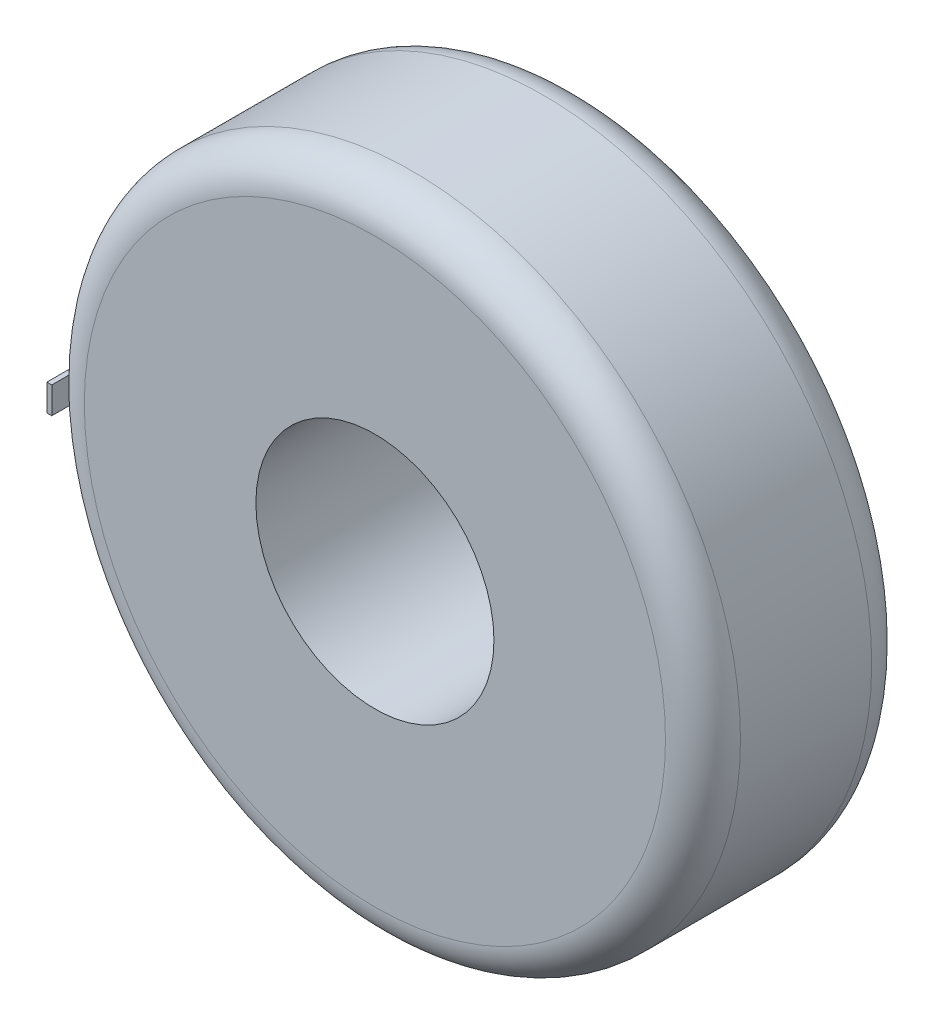
ISO-10303-21;
HEADER;
FILE_DESCRIPTION(('STEP AP214'),'2;1');
FILE_NAME('part.step','',(''),(''),'','','');
FILE_SCHEMA(('AUTOMOTIVE_DESIGN { 1 0 10303 214 1 1 1 1 }'));
ENDSEC;
DATA;
#1=APPLICATION_CONTEXT('core data for automotive mechanical design processes');
#2=APPLICATION_PROTOCOL_DEFINITION('international standard','automotive_design',2000,#1);
#3=PRODUCT_CONTEXT('',#1,'mechanical');
#4=PRODUCT('Part','Part','',(#3));
#5=PRODUCT_RELATED_PRODUCT_CATEGORY('part','',(#4));
#6=PRODUCT_DEFINITION_FORMATION('','',#4);
#7=PRODUCT_DEFINITION_CONTEXT('part definition',#1,'design');
#8=PRODUCT_DEFINITION('design','',#6,#7);
#9=PRODUCT_DEFINITION_SHAPE('','',#8);
#10=(LENGTH_UNIT() NAMED_UNIT(*) SI_UNIT(.MILLI.,.METRE.));
#11=(NAMED_UNIT(*) PLANE_ANGLE_UNIT() SI_UNIT($,.RADIAN.));
#12=(NAMED_UNIT(*) SI_UNIT($,.STERADIAN.) SOLID_ANGLE_UNIT());
#13=UNCERTAINTY_MEASURE_WITH_UNIT(LENGTH_MEASURE(1.E-05),#10,'distance_accuracy_value','');
#14=(GEOMETRIC_REPRESENTATION_CONTEXT(3) GLOBAL_UNCERTAINTY_ASSIGNED_CONTEXT((#13)) GLOBAL_UNIT_ASSIGNED_CONTEXT((#10,
#11,#12)) REPRESENTATION_CONTEXT('',''));
#15=CARTESIAN_POINT('',(0.,0.,0.));
#16=DIRECTION('',(0.,0.,1.));
#17=DIRECTION('',(1.,0.,0.));
#18=AXIS2_PLACEMENT_3D('',#15,#16,#17);
#19=CARTESIAN_POINT('',(0.,0.,11.));
#20=DIRECTION('',(0.,0.,1.));
#21=DIRECTION('',(1.,0.,0.));
#22=AXIS2_PLACEMENT_3D('',#19,#20,#21);
#23=PLANE('',#22);
#24=CARTESIAN_POINT('',(0.,0.,11.));
#25=DIRECTION('',(0.,0.,1.));
#26=DIRECTION('',(1.,0.,0.));
#27=AXIS2_PLACEMENT_3D('',#24,#25,#26);
#28=CIRCLE('',#27,15.5);
#29=CARTESIAN_POINT('',(15.5,0.,11.));
#30=VERTEX_POINT('',#29);
#31=EDGE_CURVE('E172',#30,#30,#28,.T.);
#32=ORIENTED_EDGE('',*,*,#31,.T.);
#33=EDGE_LOOP('',(#32));
#34=FACE_BOUND('',#33,.T.);
#35=CARTESIAN_POINT('',(0.,0.,11.));
#36=DIRECTION('',(0.,0.,1.));
#37=DIRECTION('',(1.,0.,0.));
#38=AXIS2_PLACEMENT_3D('',#35,#36,#37);
#39=CIRCLE('',#38,6.35);
#40=CARTESIAN_POINT('',(6.35,0.,11.));
#41=VERTEX_POINT('',#40);
#42=EDGE_CURVE('E192',#41,#41,#39,.T.);
#43=ORIENTED_EDGE('',*,*,#42,.F.);
#44=EDGE_LOOP('',(#43));
#45=FACE_BOUND('',#44,.T.);
#46=ADVANCED_FACE('F33',(#34,#45),#23,.T.);
#47=CARTESIAN_POINT('',(0.,0.,0.));
#48=DIRECTION('',(0.,0.,1.));
#49=DIRECTION('',(1.,0.,0.));
#50=AXIS2_PLACEMENT_3D('',#47,#48,#49);
#51=PLANE('',#50);
#52=CARTESIAN_POINT('',(0.,0.,0.));
#53=DIRECTION('',(0.,0.,1.));
#54=DIRECTION('',(1.,0.,0.));
#55=AXIS2_PLACEMENT_3D('',#52,#53,#54);
#56=CIRCLE('',#55,15.5);
#57=CARTESIAN_POINT('',(15.5,0.,0.));
#58=VERTEX_POINT('',#57);
#59=EDGE_CURVE('E194',#58,#58,#56,.F.);
#60=ORIENTED_EDGE('',*,*,#59,.T.);
#61=EDGE_LOOP('',(#60));
#62=FACE_BOUND('',#61,.T.);
#63=CARTESIAN_POINT('',(0.,0.,0.));
#64=DIRECTION('',(0.,0.,1.));
#65=DIRECTION('',(1.,0.,0.));
#66=AXIS2_PLACEMENT_3D('',#63,#64,#65);
#67=CIRCLE('',#66,6.35);
#68=CARTESIAN_POINT('',(6.35,0.,0.));
#69=VERTEX_POINT('',#68);
#70=EDGE_CURVE('E197',#69,#69,#67,.T.);
#71=ORIENTED_EDGE('',*,*,#70,.T.);
#72=EDGE_LOOP('',(#71));
#73=FACE_BOUND('',#72,.T.);
#74=ADVANCED_FACE('F218',(#62,#73),#51,.F.);
#75=CARTESIAN_POINT('',(0.,0.,11.));
#76=DIRECTION('',(0.,0.,-1.));
#77=DIRECTION('',(-1.,0.,0.));
#78=AXIS2_PLACEMENT_3D('',#75,#76,#77);
#79=CYLINDRICAL_SURFACE('',#78,17.5);
#80=CARTESIAN_POINT('',(0.,0.,2.));
#81=DIRECTION('',(0.,0.,1.));
#82=DIRECTION('',(1.,0.,0.));
#83=AXIS2_PLACEMENT_3D('',#80,#81,#82);
#84=CIRCLE('',#83,17.5);
#85=CARTESIAN_POINT('',(-17.4418835670975,-1.42502548461931,2.));
#86=VERTEX_POINT('',#85);
#87=CARTESIAN_POINT('',(-17.5,0.,2.));
#88=VERTEX_POINT('',#87);
#89=EDGE_CURVE('E190',#86,#88,#84,.T.);
#90=ORIENTED_EDGE('',*,*,#89,.T.);
#91=DIRECTION('',(0.,0.,1.));
#92=VECTOR('',#91,1.);
#93=CARTESIAN_POINT('',(-17.5,0.,-1.44910891739145));
#94=LINE('',#93,#92);
#95=CARTESIAN_POINT('',(-17.5,0.,9.));
#96=VERTEX_POINT('',#95);
#97=EDGE_CURVE('E136',#88,#96,#94,.T.);
#98=ORIENTED_EDGE('',*,*,#97,.T.);
#99=CARTESIAN_POINT('',(0.,0.,9.));
#100=DIRECTION('',(0.,0.,1.));
#101=DIRECTION('',(1.,0.,0.));
#102=AXIS2_PLACEMENT_3D('',#99,#100,#101);
#103=CIRCLE('',#102,17.5);
#104=CARTESIAN_POINT('',(-17.4418835670975,-1.42502548461931,9.));
#105=VERTEX_POINT('',#104);
#106=EDGE_CURVE('E188',#96,#105,#103,.F.);
#107=ORIENTED_EDGE('',*,*,#106,.T.);
#108=DIRECTION('',(0.,0.,-1.));
#109=VECTOR('',#108,1.);
#110=CARTESIAN_POINT('',(-17.4418835670975,-1.42502548461931,11.));
#111=LINE('',#110,#109);
#112=EDGE_CURVE('E146',#105,#86,#111,.T.);
#113=ORIENTED_EDGE('',*,*,#112,.T.);
#114=EDGE_LOOP('',(#90,#98,#107,#113));
#115=FACE_BOUND('',#114,.T.);
#116=ADVANCED_FACE('F187',(#115),#79,.T.);
#117=CARTESIAN_POINT('',(0.,0.,11.));
#118=DIRECTION('',(0.,0.,-1.));
#119=DIRECTION('',(-1.,0.,0.));
#120=AXIS2_PLACEMENT_3D('',#117,#118,#119);
#121=CYLINDRICAL_SURFACE('',#120,6.35);
#122=ORIENTED_EDGE('',*,*,#42,.T.);
#123=EDGE_LOOP('',(#122));
#124=FACE_BOUND('',#123,.T.);
#125=ORIENTED_EDGE('',*,*,#70,.F.);
#126=EDGE_LOOP('',(#125));
#127=FACE_BOUND('',#126,.T.);
#128=ADVANCED_FACE('F216',(#124,#127),#121,.F.);
#129=CARTESIAN_POINT('',(0.,0.,2.));
#130=DIRECTION('',(0.,0.,1.));
#131=DIRECTION('',(1.,0.,0.));
#132=AXIS2_PLACEMENT_3D('',#129,#130,#131);
#133=TOROIDAL_SURFACE('',#132,15.5,2.);
#134=CARTESIAN_POINT('',(-15.5,0.,2.));
#135=DIRECTION('',(0.,1.,0.));
#136=DIRECTION('',(0.,0.,1.));
#137=AXIS2_PLACEMENT_3D('',#134,#135,#136);
#138=CIRCLE('',#137,2.);
#139=CARTESIAN_POINT('',(-17.2369049170947,0.,1.00845508978557));
#140=VERTEX_POINT('',#139);
#141=EDGE_CURVE('E238',#88,#140,#138,.F.);
#142=ORIENTED_EDGE('',*,*,#141,.F.);
#143=ORIENTED_EDGE('',*,*,#89,.F.);
#144=CARTESIAN_POINT('',(-17.3052680735873,-1.42502548461931,1.27467670188578));
#145=CARTESIAN_POINT('',(-17.3460022628055,-1.42502548461931,1.37901067699506));
#146=CARTESIAN_POINT('',(-17.3779622586004,-1.42502548461931,1.48685684506726));
#147=CARTESIAN_POINT('',(-17.4233465527636,-1.42502548461931,1.70647310405321));
#148=CARTESIAN_POINT('',(-17.4367489394136,-1.42502548461931,1.81824767406365));
#149=CARTESIAN_POINT('',(-17.4445826719234,-1.42502548461931,2.04241967446212));
#150=CARTESIAN_POINT('',(-17.4390225578187,-1.42502548461931,2.15481680170802));
#151=CARTESIAN_POINT('',(-17.4091080530569,-1.42502548461931,2.37705058480861));
#152=CARTESIAN_POINT('',(-17.3847582320389,-1.42502548461931,2.48688785652773));
#153=CARTESIAN_POINT('',(-17.3179756734348,-1.42502548461931,2.70091544034579));
#154=CARTESIAN_POINT('',(-17.2755435966691,-1.42502548461931,2.80510595864986));
#155=CARTESIAN_POINT('',(-17.1738153291212,-1.42502548461931,3.00490404573046));
#156=CARTESIAN_POINT('',(-17.1145184119485,-1.42502548461931,3.10051124457891));
#157=CARTESIAN_POINT('',(-16.980651867048,-1.42502548461931,3.28059670582424));
#158=CARTESIAN_POINT('',(-16.9060577805714,-1.42502548461931,3.36505678507391));
#159=CARTESIAN_POINT('',(-16.7437880109847,-1.42502548461931,3.52030182894119));
#160=CARTESIAN_POINT('',(-16.6561121623836,-1.42502548461931,3.5910866205334));
#161=CARTESIAN_POINT('',(-16.4698811727818,-1.42502548461931,3.71720969757657));
#162=CARTESIAN_POINT('',(-16.3712932706116,-1.42502548461931,3.77249960620575));
#163=CARTESIAN_POINT('',(-16.1662593204542,-1.42502548461931,3.86581104194098));
#164=CARTESIAN_POINT('',(-16.05981313263,-1.42502548461931,3.90383226166711));
#165=CARTESIAN_POINT('',(-15.8416744743248,-1.42502548461931,3.96166836707796));
#166=CARTESIAN_POINT('',(-15.7299645222495,-1.42502548461931,3.98141732230111));
#167=CARTESIAN_POINT('',(-15.5048145655943,-1.42502548461931,4.00193709085912));
#168=CARTESIAN_POINT('',(-15.3913745277718,-1.42502548461931,4.00270753907354));
#169=CARTESIAN_POINT('',(-15.1656528638617,-1.42502548461931,3.98523478084383));
#170=CARTESIAN_POINT('',(-15.0533752886722,-1.42502548461931,3.96693920234455));
#171=CARTESIAN_POINT('',(-14.8334803847545,-1.42502548461931,3.91176900932254));
#172=CARTESIAN_POINT('',(-14.725863092619,-1.42502548461931,3.87489424894436));
#173=CARTESIAN_POINT('',(-14.518295291096,-1.42502548461931,3.7835712668335));
#174=CARTESIAN_POINT('',(-14.4183487159394,-1.42502548461931,3.72911410083958));
#175=CARTESIAN_POINT('',(-14.2290461213113,-1.42502548461931,3.60415345517369));
#176=CARTESIAN_POINT('',(-14.1396900069376,-1.42502548461931,3.53365011930962));
#177=CARTESIAN_POINT('',(-13.974358307537,-1.42502548461931,3.37877265736522));
#178=CARTESIAN_POINT('',(-13.8983498005704,-1.42502548461931,3.29443368089987));
#179=CARTESIAN_POINT('',(-13.761652701527,-1.42502548461931,3.11413916660081));
#180=CARTESIAN_POINT('',(-13.7009637112369,-1.42502548461931,3.01818393081442));
#181=CARTESIAN_POINT('',(-13.5969426633046,-1.42502548461931,2.81787161737186));
#182=CARTESIAN_POINT('',(-13.5535287004535,-1.42502548461931,2.71355707392224));
#183=CARTESIAN_POINT('',(-13.4849243834985,-1.42502548461931,2.49909851059218));
#184=CARTESIAN_POINT('',(-13.4597334882075,-1.42502548461931,2.38895466393414));
#185=CARTESIAN_POINT('',(-13.4283974477549,-1.42502548461931,2.16652128955168));
#186=CARTESIAN_POINT('',(-13.422163069025,-1.42502548461931,2.05424432614083));
#187=CARTESIAN_POINT('',(-13.4286711390919,-1.42502548461931,1.83024288461764));
#188=CARTESIAN_POINT('',(-13.4414132959892,-1.42502548461931,1.71851839803355));
#189=CARTESIAN_POINT('',(-13.4854564831895,-1.42502548461931,1.49900480794745));
#190=CARTESIAN_POINT('',(-13.5167234612089,-1.42502548461931,1.39120886796497));
#191=CARTESIAN_POINT('',(-13.5968722105746,-1.42502548461931,1.18237896203206));
#192=CARTESIAN_POINT('',(-13.6457541279025,-1.42502548461931,1.08134505212933));
#193=CARTESIAN_POINT('',(-13.7598402692249,-1.42502548461931,0.888657074983455));
#194=CARTESIAN_POINT('',(-13.8250801911184,-1.42502548461931,0.797024147898838));
#195=CARTESIAN_POINT('',(-13.9699491477924,-1.42502548461931,0.625944243601955));
#196=CARTESIAN_POINT('',(-14.0495785210592,-1.42502548461931,0.546497553130646));
#197=CARTESIAN_POINT('',(-14.221375595204,-1.42502548461931,0.401634112621039));
#198=CARTESIAN_POINT('',(-14.3136019967182,-1.42502548461931,0.336286978310165));
#199=CARTESIAN_POINT('',(-14.5076756963183,-1.42502548461931,0.221918371218422));
#200=CARTESIAN_POINT('',(-14.6095232682185,-1.42502548461931,0.172897363252043));
#201=CARTESIAN_POINT('',(-14.8204605864698,-1.42502548461931,0.0923451929980738));
#202=CARTESIAN_POINT('',(-14.9295818750363,-1.42502548461931,0.0608966132088914));
#203=CARTESIAN_POINT('',(-15.1515509271021,-1.42502548461931,0.0167186161855342));
#204=CARTESIAN_POINT('',(-15.26439875646,-1.42502548461931,0.00398952996028169));
#205=CARTESIAN_POINT('',(-15.4908928028355,-1.42502548461931,-0.00239491500262424));
#206=CARTESIAN_POINT('',(-15.6045402559885,-1.42502548461931,0.00399344556979407));
#207=CARTESIAN_POINT('',(-15.8291431856376,-1.42502548461931,0.0357724666266608));
#208=CARTESIAN_POINT('',(-15.9400987671175,-1.42502548461931,0.0611623848110865));
#209=CARTESIAN_POINT('',(-16.1560701551821,-1.42502548461931,0.130216535100121));
#210=CARTESIAN_POINT('',(-16.2610907493607,-1.42502548461931,0.173865791962809));
#211=CARTESIAN_POINT('',(-16.4623108166621,-1.42502548461931,0.278239514037368));
#212=CARTESIAN_POINT('',(-16.5585082064019,-1.42502548461931,0.338967998394732));
#213=CARTESIAN_POINT('',(-16.739057177941,-1.42502548461931,0.475610150314166));
#214=CARTESIAN_POINT('',(-16.8234366039635,-1.42502548461931,0.551487066625114));
#215=CARTESIAN_POINT('',(-16.9781181614049,-1.42502548461931,0.716323186292165));
#216=CARTESIAN_POINT('',(-17.0484374127275,-1.42502548461931,0.805266248224176));
#217=CARTESIAN_POINT('',(-17.149662368654,-1.42502548461931,0.958315009478631));
#218=CARTESIAN_POINT('',(-17.1854644272891,-1.42502548461931,1.01924257438948));
#219=CARTESIAN_POINT('',(-17.2504290854945,-1.42502548461931,1.14454049975914));
#220=CARTESIAN_POINT('',(-17.279591696562,-1.42502548461931,1.20891085425591));
#221=CARTESIAN_POINT('',(-17.3052680735873,-1.42502548461931,1.27467670188578));
#222=B_SPLINE_CURVE_WITH_KNOTS('',3,(#144,#145,#146,#147,#148,#149,#150,#151,#152,#153,#154,
#155,#156,#157,#158,#159,#160,#161,#162,#163,#164,#165,#166,#167,#168,#169,#170,#171,#172,#173,
#174,#175,#176,#177,#178,#179,#180,#181,#182,#183,#184,#185,#186,#187,#188,#189,#190,#191,#192,
#193,#194,#195,#196,#197,#198,#199,#200,#201,#202,#203,#204,#205,#206,#207,#208,#209,#210,#211,
#212,#213,#214,#215,#216,#217,#218,#219,#220,#221),.UNSPECIFIED.,.T.,.F.,(4,2,2,2,2,2,2,2,2,2,2,
2,2,2,2,2,2,2,2,2,2,2,2,2,2,2,2,2,2,2,2,2,2,2,2,2,2,2,4),(0.,0.335754024747361,
0.671904150739835,1.00790290667464,1.34381997377057,1.67972476574898,2.01564402777297,
2.35210464074366,2.68856951047399,3.02607344780395,3.36358339241483,3.70230645338966,
4.04103603092643,4.38069851614877,4.72036366792549,5.06020188209957,5.40003705071836,
5.73902186700653,6.07799787086487,6.41534698781088,6.75268608578159,7.08843475759283,
7.42417826492859,7.75930651580388,8.09443754407567,8.43030638935784,8.76618313638922,
9.10368211615748,9.44119070390039,9.78027236933803,10.1193600305419,10.4592237367413,
10.7990741667833,11.1386464161448,11.4782986418339,11.8171366455354,12.1555595277447,
12.3671989888817,12.5788380835248),.UNSPECIFIED.);
#223=CARTESIAN_POINT('',(-17.2369049170947,-1.42502548461931,1.11941772422863));
#224=VERTEX_POINT('',#223);
#225=EDGE_CURVE('E54',#224,#86,#222,.T.);
#226=ORIENTED_EDGE('',*,*,#225,.F.);
#227=CARTESIAN_POINT('',(-17.2369049170947,-0.71001602902974,1.03451026779265));
#228=CARTESIAN_POINT('',(-17.2369049170947,-0.827523672608818,1.0432896542555));
#229=CARTESIAN_POINT('',(-17.2369049170947,-0.944854839223642,1.05436464342254));
#230=CARTESIAN_POINT('',(-17.2369049170947,-1.17891144460346,1.08168574661522));
#231=CARTESIAN_POINT('',(-17.2369049170947,-1.29563698044467,1.09793100413307));
#232=CARTESIAN_POINT('',(-17.2369049170947,-1.52831513052482,1.13654605373252));
#233=CARTESIAN_POINT('',(-17.2369049170947,-1.64426580302858,1.15892768089921));
#234=CARTESIAN_POINT('',(-17.2369049170947,-1.87439964866443,1.21128509995489));
#235=CARTESIAN_POINT('',(-17.2369049170947,-1.98858445352791,1.24125337378039));
#236=CARTESIAN_POINT('',(-17.2369049170947,-2.15796054247627,1.29407822435602));
#237=CARTESIAN_POINT('',(-17.2369049170947,-2.21434652374555,1.31310003223596));
#238=CARTESIAN_POINT('',(-17.2369049170947,-2.32593025524865,1.35433204398076));
#239=CARTESIAN_POINT('',(-17.2369049170947,-2.38112856009042,1.37654072081204));
#240=CARTESIAN_POINT('',(-17.2369049170947,-2.48950357697138,1.42481638835107));
#241=CARTESIAN_POINT('',(-17.2369049170947,-2.542688961489,1.45086368619722));
#242=CARTESIAN_POINT('',(-17.2369049170947,-2.64622397491023,1.50802080456142));
#243=CARTESIAN_POINT('',(-17.2369049170947,-2.6965796000673,1.53911933159151));
#244=CARTESIAN_POINT('',(-17.2369049170947,-2.7772795053464,1.59728712132358));
#245=CARTESIAN_POINT('',(-17.2369049170947,-2.80892482101948,1.62253188639713));
#246=CARTESIAN_POINT('',(-17.2369049170947,-2.86857827563081,1.67703624351694));
#247=CARTESIAN_POINT('',(-17.2369049170947,-2.89659482465087,1.70628621689076));
#248=CARTESIAN_POINT('',(-17.2369049170947,-2.93708883240059,1.75749531508146));
#249=CARTESIAN_POINT('',(-17.2369049170947,-2.95141631230933,1.77797737578951));
#250=CARTESIAN_POINT('',(-17.2369049170947,-2.976906452563,1.82084263137218));
#251=CARTESIAN_POINT('',(-17.2369049170947,-2.98807338477943,1.8432232064409));
#252=CARTESIAN_POINT('',(-17.2369049170947,-3.00461618010462,1.88556756292627));
#253=CARTESIAN_POINT('',(-17.2369049170947,-3.01066488289184,1.90526484942073));
#254=CARTESIAN_POINT('',(-17.2369049170947,-3.01936245033241,1.94539540688621));
#255=CARTESIAN_POINT('',(-17.2369049170947,-3.02201492046023,1.96582787364311));
#256=CARTESIAN_POINT('',(-17.2369049170947,-3.02363873526179,2.00690133702176));
#257=CARTESIAN_POINT('',(-17.2369049170947,-3.02259957647559,2.02754276175934));
#258=CARTESIAN_POINT('',(-17.2369049170947,-3.01693698349509,2.06832826120587));
#259=CARTESIAN_POINT('',(-17.2369049170947,-3.01231065583005,2.08847192086812));
#260=CARTESIAN_POINT('',(-17.2369049170947,-2.99852000984443,2.13223895960569));
#261=CARTESIAN_POINT('',(-17.2369049170947,-2.98856169421544,2.15560896491597));
#262=CARTESIAN_POINT('',(-17.2369049170947,-2.96502755116358,2.20044188860351));
#263=CARTESIAN_POINT('',(-17.2369049170947,-2.95144430513646,2.22190077428535));
#264=CARTESIAN_POINT('',(-17.2369049170947,-2.91241446640091,2.27559833980869));
#265=CARTESIAN_POINT('',(-17.2369049170947,-2.88483509507895,2.30626821187153));
#266=CARTESIAN_POINT('',(-17.2369049170947,-2.82558006914859,2.36330795043747));
#267=CARTESIAN_POINT('',(-17.2369049170947,-2.79389335650603,2.38966575791789));
#268=CARTESIAN_POINT('',(-17.2369049170947,-2.72630837361254,2.4401457418383));
#269=CARTESIAN_POINT('',(-17.2369049170947,-2.69027850132865,2.46408910734383));
#270=CARTESIAN_POINT('',(-17.2369049170947,-2.61635399195003,2.50893018472545));
#271=CARTESIAN_POINT('',(-17.2369049170947,-2.57845731426497,2.52982446021274));
#272=CARTESIAN_POINT('',(-17.2369049170947,-2.46274364883624,2.58888441755618));
#273=CARTESIAN_POINT('',(-17.2369049170947,-2.38303790441832,2.6233351207884));
#274=CARTESIAN_POINT('',(-17.2369049170947,-2.23553461168645,2.67970972559838));
#275=CARTESIAN_POINT('',(-17.2369049170947,-2.16814865266031,2.70277195051829));
#276=CARTESIAN_POINT('',(-17.2369049170947,-2.03218856078223,2.7451192834891));
#277=CARTESIAN_POINT('',(-17.2369049170947,-1.96361419943954,2.76440365621328));
#278=CARTESIAN_POINT('',(-17.2369049170947,-1.75645640868064,2.8176901422547));
#279=CARTESIAN_POINT('',(-17.2369049170947,-1.61668231030442,2.84703899689477));
#280=CARTESIAN_POINT('',(-17.2369049170947,-1.3351193321103,2.89661908565078));
#281=CARTESIAN_POINT('',(-17.2369049170947,-1.19332520944354,2.91681890714193));
#282=CARTESIAN_POINT('',(-17.2369049170947,-0.909025530855515,2.94961632038304));
#283=CARTESIAN_POINT('',(-17.2369049170947,-0.766520862552574,2.96222175422394));
#284=CARTESIAN_POINT('',(-17.2369049170947,-0.441466243809609,2.98338113371496));
#285=CARTESIAN_POINT('',(-17.2369049170947,-0.258780731783528,2.98983917366781));
#286=CARTESIAN_POINT('',(-17.2369049170947,0.106802756157759,2.99266371300514));
#287=CARTESIAN_POINT('',(-17.2369049170947,0.289700787619459,2.98902247712818));
#288=CARTESIAN_POINT('',(-17.2369049170947,0.655191003781385,2.97121424143081));
#289=CARTESIAN_POINT('',(-17.2369049170947,0.837782638061372,2.9570357766442));
#290=CARTESIAN_POINT('',(-17.2369049170947,1.20150905784256,2.91654904214236));
#291=CARTESIAN_POINT('',(-17.2369049170947,1.38264526181859,2.89025456001102));
#292=CARTESIAN_POINT('',(-17.2369049170947,1.65265652483243,2.83876018519015));
#293=CARTESIAN_POINT('',(-17.2369049170947,1.74266733629359,2.81950433988416));
#294=CARTESIAN_POINT('',(-17.2369049170947,1.92162615341613,2.77603163491346));
#295=CARTESIAN_POINT('',(-17.2369049170947,2.01057279565012,2.75180900985188));
#296=CARTESIAN_POINT('',(-17.2369049170947,2.18583311336126,2.69730559572197));
#297=CARTESIAN_POINT('',(-17.2369049170947,2.27216211753157,2.66707459662648));
#298=CARTESIAN_POINT('',(-17.2369049170947,2.44141032846286,2.59835914145935));
#299=CARTESIAN_POINT('',(-17.2369049170947,2.52433806062172,2.55989704231725));
#300=CARTESIAN_POINT('',(-17.2369049170947,2.64320518577379,2.49327699228434));
#301=CARTESIAN_POINT('',(-17.2369049170947,2.68171132134442,2.46973489319471));
#302=CARTESIAN_POINT('',(-17.2369049170947,2.75619944389188,2.41880552079392));
#303=CARTESIAN_POINT('',(-17.2369049170947,2.79218037805676,2.39141665779771));
#304=CARTESIAN_POINT('',(-17.2369049170947,2.8520350742919,2.33873222634771));
#305=CARTESIAN_POINT('',(-17.2369049170947,2.87677670234393,2.31443523000438));
#306=CARTESIAN_POINT('',(-17.2369049170947,2.92243618728171,2.26245418220608));
#307=CARTESIAN_POINT('',(-17.2369049170947,2.94336347536118,2.23477877528195));
#308=CARTESIAN_POINT('',(-17.2369049170947,2.97297977019918,2.18617303850813));
#309=CARTESIAN_POINT('',(-17.2369049170947,2.98338355684554,2.16629814996889));
#310=CARTESIAN_POINT('',(-17.2369049170947,3.00095262444123,2.12515728934085));
#311=CARTESIAN_POINT('',(-17.2369049170947,3.00812190509338,2.10389307273401));
#312=CARTESIAN_POINT('',(-17.2369049170947,3.01855312598095,2.06017517926863));
#313=CARTESIAN_POINT('',(-17.2369049170947,3.02177560901096,2.03771179722713));
#314=CARTESIAN_POINT('',(-17.2369049170947,3.02375180714256,1.99258910760752));
#315=CARTESIAN_POINT('',(-17.2369049170947,3.02250732346575,1.9699298826755));
#316=CARTESIAN_POINT('',(-17.2369049170947,3.01616040242152,1.92810150087727));
#317=CARTESIAN_POINT('',(-17.2369049170947,3.01156302246558,1.90885190719454));
#318=CARTESIAN_POINT('',(-17.2369049170947,2.99952121658231,1.87127323503943));
#319=CARTESIAN_POINT('',(-17.2369049170947,2.99207509921177,1.85294471078249));
#320=CARTESIAN_POINT('',(-17.2369049170947,2.97019770826705,1.80781734323252));
#321=CARTESIAN_POINT('',(-17.2369049170947,2.95416663753734,1.78179872017301));
#322=CARTESIAN_POINT('',(-17.2369049170947,2.91829600843872,1.73254047123734));
#323=CARTESIAN_POINT('',(-17.2369049170947,2.89844544963904,1.7093091947662));
#324=CARTESIAN_POINT('',(-17.2369049170947,2.83891599887594,1.64735895315387));
#325=CARTESIAN_POINT('',(-17.2369049170947,2.79629326863583,1.61150364653386));
#326=CARTESIAN_POINT('',(-17.2369049170947,2.70663366869469,1.54592832238758));
#327=CARTESIAN_POINT('',(-17.2369049170947,2.65958432548144,1.51622644588582));
#328=CARTESIAN_POINT('',(-17.2369049170947,2.54032889021929,1.44864287793699));
#329=CARTESIAN_POINT('',(-17.2369049170947,2.46663385277184,1.41341710782063));
#330=CARTESIAN_POINT('',(-17.2369049170947,2.31627216023883,1.34987854126157));
#331=CARTESIAN_POINT('',(-17.2369049170947,2.23959941474603,1.32158088259212));
#332=CARTESIAN_POINT('',(-17.2369049170947,2.08412948349447,1.27013826654982));
#333=CARTESIAN_POINT('',(-17.2369049170947,2.00532343513125,1.24702041412635));
#334=CARTESIAN_POINT('',(-17.2369049170947,1.84668574378237,1.20505081349464));
#335=CARTESIAN_POINT('',(-17.2369049170947,1.76685513961209,1.18619505714941));
#336=CARTESIAN_POINT('',(-17.2369049170947,1.58852266407818,1.14816826966148));
#337=CARTESIAN_POINT('',(-17.2369049170947,1.48983603212594,1.12986892400449));
#338=CARTESIAN_POINT('',(-17.2369049170947,1.29174362402935,1.09764473822112));
#339=CARTESIAN_POINT('',(-17.2369049170947,1.19233767185574,1.08372100865353));
#340=CARTESIAN_POINT('',(-17.2369049170947,0.893199187182125,1.04758355933934));
#341=CARTESIAN_POINT('',(-17.2369049170947,0.692769419787028,1.03104791119825));
#342=CARTESIAN_POINT('',(-17.2369049170947,0.291719421103224,1.01068682497187));
#343=CARTESIAN_POINT('',(-17.2369049170947,0.0911002978114798,1.00683699893614));
#344=CARTESIAN_POINT('',(-17.2369049170947,-0.309854611673889,1.01128945468024));
#345=CARTESIAN_POINT('',(-17.2369049170947,-0.510190489276612,1.01958063781109));
#346=CARTESIAN_POINT('',(-17.2369049170947,-0.71001602902974,1.03451026779265));
#347=B_SPLINE_CURVE_WITH_KNOTS('',3,(#227,#228,#229,#230,#231,#232,#233,#234,#235,#236,#237,
#238,#239,#240,#241,#242,#243,#244,#245,#246,#247,#248,#249,#250,#251,#252,#253,#254,#255,#256,
#257,#258,#259,#260,#261,#262,#263,#264,#265,#266,#267,#268,#269,#270,#271,#272,#273,#274,#275,
#276,#277,#278,#279,#280,#281,#282,#283,#284,#285,#286,#287,#288,#289,#290,#291,#292,#293,#294,
#295,#296,#297,#298,#299,#300,#301,#302,#303,#304,#305,#306,#307,#308,#309,#310,#311,#312,#313,
#314,#315,#316,#317,#318,#319,#320,#321,#322,#323,#324,#325,#326,#327,#328,#329,#330,#331,#332,
#333,#334,#335,#336,#337,#338,#339,#340,#341,#342,#343,#344,#345,#346),.UNSPECIFIED.,.T.,.F.,(4,
2,2,2,2,2,2,2,2,2,2,2,2,2,2,2,2,2,2,2,2,2,2,2,2,2,2,2,2,2,2,2,2,2,2,2,2,2,2,2,2,2,2,2,2,2,2,2,2,
2,2,2,2,2,2,2,2,2,2,4),(0.,0.353469390505349,0.706880255646395,1.06097759078385,1.4147253938646,
1.59317868362381,1.77154674872509,1.9490297034506,2.12612117172826,2.2473382902421,
2.36826924611662,2.44305364979002,2.51773648502894,2.57929444502133,2.6407870001379,
2.70245465444502,2.76417210273103,2.83995682084299,2.9158978417134,3.03893900750401,
3.16231859339942,3.2918958654562,3.42161806430085,3.68154827034324,3.89511869463202,
4.10873064737083,4.53672812371429,4.96618416505978,5.39519597946345,5.94329431642845,
6.49181257008281,7.04092851096253,7.58942111539044,7.86546440598121,8.14182995798894,
8.41599425908231,8.68942313089694,8.82466845162211,8.95996982817809,9.06375364731687,
9.16727726634605,9.23435557541863,9.30135070837736,9.36901028226475,9.43664257674752,
9.49576620831391,9.55492499926654,9.64607959195116,9.73750075685912,9.9036556221251,
10.0702935713108,10.3147364682004,10.5597087941056,10.8059345371605,11.0519277535578,
11.3529083954736,11.6539653665817,12.2567606369189,12.8583963809419,13.4594824855782),.UNSPECIFIED.);
#348=EDGE_CURVE('E49',#140,#224,#347,.T.);
#349=ORIENTED_EDGE('',*,*,#348,.F.);
#350=EDGE_LOOP('',(#142,#143,#226,#349));
#351=FACE_BOUND('',#350,.T.);
#352=ORIENTED_EDGE('',*,*,#59,.F.);
#353=EDGE_LOOP('',(#352));
#354=FACE_BOUND('',#353,.T.);
#355=ADVANCED_FACE('F156',(#351,#354),#133,.T.);
#356=CARTESIAN_POINT('',(0.,0.,9.));
#357=DIRECTION('',(0.,0.,1.));
#358=DIRECTION('',(1.,0.,0.));
#359=AXIS2_PLACEMENT_3D('',#356,#357,#358);
#360=TOROIDAL_SURFACE('',#359,15.5,2.);
#361=CARTESIAN_POINT('',(-15.5,0.,9.));
#362=DIRECTION('',(0.,1.,0.));
#363=DIRECTION('',(0.,0.,1.));
#364=AXIS2_PLACEMENT_3D('',#361,#362,#363);
#365=CIRCLE('',#364,2.);
#366=CARTESIAN_POINT('',(-17.2369049170947,-2.21963322027993E-11,9.99154491021443));
#367=VERTEX_POINT('',#366);
#368=EDGE_CURVE('E11',#367,#96,#365,.F.);
#369=ORIENTED_EDGE('',*,*,#368,.F.);
#370=CARTESIAN_POINT('',(-17.2369049170947,-0.71001602902974,9.96548973220735));
#371=CARTESIAN_POINT('',(-17.2369049170947,-0.517761340688419,9.97985287311268));
#372=CARTESIAN_POINT('',(-17.2369049170947,-0.325033369216806,9.98806678466616));
#373=CARTESIAN_POINT('',(-17.2369049170947,0.0607046638130502,9.99324686220091));
#374=CARTESIAN_POINT('',(-17.2369049170947,0.253714826212796,9.99020354088969));
#375=CARTESIAN_POINT('',(-17.2369049170947,0.640810580862675,9.97242063726836));
#376=CARTESIAN_POINT('',(-17.2369049170947,0.834892290743652,9.95758691390843));
#377=CARTESIAN_POINT('',(-17.2369049170947,1.12470668688174,9.92497558457265));
#378=CARTESIAN_POINT('',(-17.2369049170947,1.22103393690179,9.91238939556764));
#379=CARTESIAN_POINT('',(-17.2369049170947,1.41308186231448,9.88326892839834));
#380=CARTESIAN_POINT('',(-17.2369049170947,1.50880264876218,9.86673539585595));
#381=CARTESIAN_POINT('',(-17.2369049170947,1.7002451600549,9.82884058297189));
#382=CARTESIAN_POINT('',(-17.2369049170947,1.79595829848964,9.80743503927686));
#383=CARTESIAN_POINT('',(-17.2369049170947,1.98610273499158,9.75870946799329));
#384=CARTESIAN_POINT('',(-17.2369049170947,2.08053087253433,9.73137695358295));
#385=CARTESIAN_POINT('',(-17.2369049170947,2.26554824912751,9.66946834754322));
#386=CARTESIAN_POINT('',(-17.2369049170947,2.35617370987744,9.63500614418707));
#387=CARTESIAN_POINT('',(-17.2369049170947,2.48839189312908,9.5754310109458));
#388=CARTESIAN_POINT('',(-17.2369049170947,2.53177305872752,9.55430214278353));
#389=CARTESIAN_POINT('',(-17.2369049170947,2.61676580631341,9.50877199685684));
#390=CARTESIAN_POINT('',(-17.2369049170947,2.65837926665181,9.48437431319436));
#391=CARTESIAN_POINT('',(-17.2369049170947,2.72579305043512,9.44003390974384));
#392=CARTESIAN_POINT('',(-17.2369049170947,2.75233407030924,9.421223529043));
#393=CARTESIAN_POINT('',(-17.2369049170947,2.80372987884348,9.38129565955427));
#394=CARTESIAN_POINT('',(-17.2369049170947,2.82858143499684,9.36017393923852));
#395=CARTESIAN_POINT('',(-17.2369049170947,2.87596413176099,9.31502448708623));
#396=CARTESIAN_POINT('',(-17.2369049170947,2.89847238269335,9.290972318428));
#397=CARTESIAN_POINT('',(-17.2369049170947,2.93956327760783,9.23969697553812));
#398=CARTESIAN_POINT('',(-17.2369049170947,2.95815579091432,9.21248204842558));
#399=CARTESIAN_POINT('',(-17.2369049170947,2.98401806237733,9.1647952180501));
#400=CARTESIAN_POINT('',(-17.2369049170947,2.9929795214363,9.14524947297155));
#401=CARTESIAN_POINT('',(-17.2369049170947,3.00769282391612,9.10498270338625));
#402=CARTESIAN_POINT('',(-17.2369049170947,3.01344888029748,9.08426326117897));
#403=CARTESIAN_POINT('',(-17.2369049170947,3.02120309162741,9.04194764845247));
#404=CARTESIAN_POINT('',(-17.2369049170947,3.02317193885909,9.02034595114625));
#405=CARTESIAN_POINT('',(-17.2369049170947,3.02301536580777,8.97715495733231));
#406=CARTESIAN_POINT('',(-17.2369049170947,3.02088967649408,8.95556566173268));
#407=CARTESIAN_POINT('',(-17.2369049170947,3.01317859908712,8.91506158411));
#408=CARTESIAN_POINT('',(-17.2369049170947,3.00792355529123,8.89608152637043));
#409=CARTESIAN_POINT('',(-17.2369049170947,2.994705954884,8.85910048601325));
#410=CARTESIAN_POINT('',(-17.2369049170947,2.9867420607491,8.84109999216863));
#411=CARTESIAN_POINT('',(-17.2369049170947,2.96304658391341,8.79552129773578));
#412=CARTESIAN_POINT('',(-17.2369049170947,2.94555063537826,8.76886487469813));
#413=CARTESIAN_POINT('',(-17.2369049170947,2.90669952362128,8.71853129381413));
#414=CARTESIAN_POINT('',(-17.2369049170947,2.88533219162686,8.69486394127034));
#415=CARTESIAN_POINT('',(-17.2369049170947,2.82061674969506,8.63095636887427));
#416=CARTESIAN_POINT('',(-17.2369049170947,2.77414094982328,8.59392288512175));
#417=CARTESIAN_POINT('',(-17.2369049170947,2.67671631327775,8.5264482752261));
#418=CARTESIAN_POINT('',(-17.2369049170947,2.625755492894,8.4960256134629));
#419=CARTESIAN_POINT('',(-17.2369049170947,2.49523950885241,8.42615455692279));
#420=CARTESIAN_POINT('',(-17.2369049170947,2.41407324722681,8.38974706759634));
#421=CARTESIAN_POINT('',(-17.2369049170947,2.24870800773867,8.32447794089913));
#422=CARTESIAN_POINT('',(-17.2369049170947,2.16450274353761,8.29563310137547));
#423=CARTESIAN_POINT('',(-17.2369049170947,1.99387462663874,8.2435371785254));
#424=CARTESIAN_POINT('',(-17.2369049170947,1.90744186788363,8.22031892446388));
#425=CARTESIAN_POINT('',(-17.2369049170947,1.73357898630601,8.17851969337853));
#426=CARTESIAN_POINT('',(-17.2369049170947,1.64614995536912,8.1599340705807));
#427=CARTESIAN_POINT('',(-17.2369049170947,1.43840684706587,8.12047255838716));
#428=CARTESIAN_POINT('',(-17.2369049170947,1.31777978837412,8.10125219554231));
#429=CARTESIAN_POINT('',(-17.2369049170947,1.07571865288987,8.06867225070058));
#430=CARTESIAN_POINT('',(-17.2369049170947,0.954284315592976,8.0553146640993));
#431=CARTESIAN_POINT('',(-17.2369049170947,0.710748358439994,8.03370801672845));
#432=CARTESIAN_POINT('',(-17.2369049170947,0.588645931984198,8.02546817085201));
#433=CARTESIAN_POINT('',(-17.2369049170947,0.344198918931527,8.01371185436836));
#434=CARTESIAN_POINT('',(-17.2369049170947,0.221854297153058,8.01019612952794));
#435=CARTESIAN_POINT('',(-17.2369049170947,-0.0226576211153711,8.00772249111626));
#436=CARTESIAN_POINT('',(-17.2369049170947,-0.144824835161311,8.00875629530164));
#437=CARTESIAN_POINT('',(-17.2369049170947,-0.389033703688328,8.01541200890502));
#438=CARTESIAN_POINT('',(-17.2369049170947,-0.511075361091921,8.02103380899534));
#439=CARTESIAN_POINT('',(-17.2369049170947,-0.754639186556568,8.03712979925188));
#440=CARTESIAN_POINT('',(-17.2369049170947,-0.876161880391406,8.04759593088211));
#441=CARTESIAN_POINT('',(-17.2369049170947,-1.11860593827125,8.07392201983475));
#442=CARTESIAN_POINT('',(-17.2369049170947,-1.23952744969904,8.08978058155771));
#443=CARTESIAN_POINT('',(-17.2369049170947,-1.45081597351134,8.12317146122928));
#444=CARTESIAN_POINT('',(-17.2369049170947,-1.54139802972277,8.13933769113473));
#445=CARTESIAN_POINT('',(-17.2369049170947,-1.72177033638424,8.17593609221613));
#446=CARTESIAN_POINT('',(-17.2369049170947,-1.81156007329773,8.19637084467502));
#447=CARTESIAN_POINT('',(-17.2369049170947,-1.98969444025292,8.24242530994924));
#448=CARTESIAN_POINT('',(-17.2369049170947,-2.07804076073385,8.2680384050117));
#449=CARTESIAN_POINT('',(-17.2369049170947,-2.25248340480642,8.32593268050375));
#450=CARTESIAN_POINT('',(-17.2369049170947,-2.33858255285875,8.35820498637397));
#451=CARTESIAN_POINT('',(-17.2369049170947,-2.49279383685921,8.42584819086484));
#452=CARTESIAN_POINT('',(-17.2369049170947,-2.56151792089699,8.4598136720411));
#453=CARTESIAN_POINT('',(-17.2369049170947,-2.69369275918393,8.53663018217057));
#454=CARTESIAN_POINT('',(-17.2369049170947,-2.75717371525306,8.57942450138921));
#455=CARTESIAN_POINT('',(-17.2369049170947,-2.83600871057682,8.64676569579896));
#456=CARTESIAN_POINT('',(-17.2369049170947,-2.85624068272109,8.66554910032666));
#457=CARTESIAN_POINT('',(-17.2369049170947,-2.89463944700058,8.70520284332945));
#458=CARTESIAN_POINT('',(-17.2369049170947,-2.91280354412016,8.72607584005911));
#459=CARTESIAN_POINT('',(-17.2369049170947,-2.94636962082186,8.77037356963126));
#460=CARTESIAN_POINT('',(-17.2369049170947,-2.96173641080042,8.79382555011574));
#461=CARTESIAN_POINT('',(-17.2369049170947,-2.98810892440142,8.84306682784481));
#462=CARTESIAN_POINT('',(-17.2369049170947,-2.99912787936899,8.8688487356461));
#463=CARTESIAN_POINT('',(-17.2369049170947,-3.01307141169511,8.91465227029035));
#464=CARTESIAN_POINT('',(-17.2369049170947,-3.01740337853418,8.93424310384927));
#465=CARTESIAN_POINT('',(-17.2369049170947,-3.02267592404769,8.97387564402009));
#466=CARTESIAN_POINT('',(-17.2369049170947,-3.02361914728243,8.99391698675982));
#467=CARTESIAN_POINT('',(-17.2369049170947,-3.02201443525469,9.03385767861178));
#468=CARTESIAN_POINT('',(-17.2369049170947,-3.01946612399296,9.05375701219924));
#469=CARTESIAN_POINT('',(-17.2369049170947,-3.01114429687165,9.0928688441099));
#470=CARTESIAN_POINT('',(-17.2369049170947,-3.00536769011743,9.11208066539691));
#471=CARTESIAN_POINT('',(-17.2369049170947,-2.98855077599499,9.15606461435767));
#472=CARTESIAN_POINT('',(-17.2369049170947,-2.97637099657497,9.18039738234656));
#473=CARTESIAN_POINT('',(-17.2369049170947,-2.94832823774872,9.22682697040456));
#474=CARTESIAN_POINT('',(-17.2369049170947,-2.93245682170668,9.24891849984159));
#475=CARTESIAN_POINT('',(-17.2369049170947,-2.88614219885686,9.30563610944335));
#476=CARTESIAN_POINT('',(-17.2369049170947,-2.85326082058429,9.33824744956192));
#477=CARTESIAN_POINT('',(-17.2369049170947,-2.78327268762461,9.3985120254249));
#478=CARTESIAN_POINT('',(-17.2369049170947,-2.74615354395899,9.42615008211795));
#479=CARTESIAN_POINT('',(-17.2369049170947,-2.65561138696386,9.48674202428414));
#480=CARTESIAN_POINT('',(-17.2369049170947,-2.6011066951016,9.51805991688854));
#481=CARTESIAN_POINT('',(-17.2369049170947,-2.48937545809067,9.57547812958735));
#482=CARTESIAN_POINT('',(-17.2369049170947,-2.43214367428027,9.6015678615766));
#483=CARTESIAN_POINT('',(-17.2369049170947,-2.31579069193463,9.64977038676963));
#484=CARTESIAN_POINT('',(-17.2369049170947,-2.25666307561345,9.67186750551956));
#485=CARTESIAN_POINT('',(-17.2369049170947,-2.13727295781872,9.71277467452173));
#486=CARTESIAN_POINT('',(-17.2369049170947,-2.07700999515682,9.73158335563459));
#487=CARTESIAN_POINT('',(-17.2369049170947,-1.91002824492293,9.77962699976413));
#488=CARTESIAN_POINT('',(-17.2369049170947,-1.80250087913628,9.80604704309186));
#489=CARTESIAN_POINT('',(-17.2369049170947,-1.58604739444453,9.8525055731858));
#490=CARTESIAN_POINT('',(-17.2369049170947,-1.47712034495355,9.87253955858498));
#491=CARTESIAN_POINT('',(-17.2369049170947,-1.25877802301765,9.90729973062189));
#492=CARTESIAN_POINT('',(-17.2369049170947,-1.14936531120906,9.92204218049609));
#493=CARTESIAN_POINT('',(-17.2369049170947,-0.930025509641652,9.94702541496615));
#494=CARTESIAN_POINT('',(-17.2369049170947,-0.820098353365249,9.95726560020174));
#495=CARTESIAN_POINT('',(-17.2369049170947,-0.71001602902974,9.96548973220735));
#496=B_SPLINE_CURVE_WITH_KNOTS('',3,(#370,#371,#372,#373,#374,#375,#376,#377,#378,#379,#380,
#381,#382,#383,#384,#385,#386,#387,#388,#389,#390,#391,#392,#393,#394,#395,#396,#397,#398,#399,
#400,#401,#402,#403,#404,#405,#406,#407,#408,#409,#410,#411,#412,#413,#414,#415,#416,#417,#418,
#419,#420,#421,#422,#423,#424,#425,#426,#427,#428,#429,#430,#431,#432,#433,#434,#435,#436,#437,
#438,#439,#440,#441,#442,#443,#444,#445,#446,#447,#448,#449,#450,#451,#452,#453,#454,#455,#456,
#457,#458,#459,#460,#461,#462,#463,#464,#465,#466,#467,#468,#469,#470,#471,#472,#473,#474,#475,
#476,#477,#478,#479,#480,#481,#482,#483,#484,#485,#486,#487,#488,#489,#490,#491,#492,#493,#494,
#495),.UNSPECIFIED.,.T.,.F.,(4,2,2,2,2,2,2,2,2,2,2,2,2,2,2,2,2,2,2,2,2,2,2,2,2,2,2,2,2,2,2,2,2,
2,2,2,2,2,2,2,2,2,2,2,2,2,2,2,2,2,2,2,2,2,2,2,2,2,2,2,2,2,4),(0.,0.578318238856022,
1.1571239797415,1.74059821905369,2.03197302713806,2.32329284031511,2.61737321532107,
2.91207927886173,3.20239821301083,3.34706004104655,3.49156409735433,3.58906384754316,
3.68674518188508,3.78530539985694,3.88361414995749,3.94789846127125,4.01209808108659,
4.07679254867633,4.14149126714774,4.20033758517091,4.25921300146776,4.35431474199635,
4.44972076860783,4.62699787708348,4.8047639408662,5.07098040753661,5.33778326762733,
5.60610725024803,5.87416105514089,6.2404198291464,6.60680316282584,6.97384430030329,
7.34094337341378,7.70737443344588,8.07379676202116,8.43961172643176,8.80533208728433,
9.08129201586036,9.35741930998606,9.63319592803734,9.90860737218856,10.1382655270832,
10.3664920611921,10.4491969246732,10.5320083706133,10.6157987418943,10.6993321182453,
10.7592624290084,10.8191459602547,10.8790359407951,10.9389833607936,11.0201533567927,
11.101510708591,11.2396589360078,11.3782219092912,11.5663603111065,11.7548759646975,
11.9441163442343,12.1334353272468,12.4653243912103,12.7974468805152,13.1285396884279,
13.4596765594615),.UNSPECIFIED.);
#497=CARTESIAN_POINT('',(-17.2369049170947,-1.42502548461931,9.88058227577149));
#498=VERTEX_POINT('',#497);
#499=EDGE_CURVE('E42',#498,#367,#496,.T.);
#500=ORIENTED_EDGE('',*,*,#499,.F.);
#501=CARTESIAN_POINT('',(-17.4251969073702,-1.42502548461931,9.25738719791375));
#502=CARTESIAN_POINT('',(-17.4107138984894,-1.42502548461931,9.36857965679323));
#503=CARTESIAN_POINT('',(-17.3868173306847,-1.42502548461931,9.47862896587111));
#504=CARTESIAN_POINT('',(-17.3208522588003,-1.42502548461931,9.69323904451151));
#505=CARTESIAN_POINT('',(-17.2787617280132,-1.42502548461931,9.79779298841698));
#506=CARTESIAN_POINT('',(-17.1776484795214,-1.42502548461931,9.99830096812129));
#507=CARTESIAN_POINT('',(-17.1186354210597,-1.42502548461931,10.094259869012));
#508=CARTESIAN_POINT('',(-16.985380116739,-1.42502548461931,10.2749037232782));
#509=CARTESIAN_POINT('',(-16.9111415918035,-1.42502548461931,10.3595914228791));
#510=CARTESIAN_POINT('',(-16.7493907836935,-1.42502548461931,10.5155053613954));
#511=CARTESIAN_POINT('',(-16.6618533527461,-1.42502548461931,10.586705510222));
#512=CARTESIAN_POINT('',(-16.4760989386671,-1.42502548461931,10.713461750752));
#513=CARTESIAN_POINT('',(-16.3778813581389,-1.42502548461931,10.769016966728));
#514=CARTESIAN_POINT('',(-16.1731943938843,-1.42502548461931,10.863109101475));
#515=CARTESIAN_POINT('',(-16.0666975981462,-1.42502548461931,10.9015863877432));
#516=CARTESIAN_POINT('',(-15.8487682212593,-1.42502548461931,10.960182725187));
#517=CARTESIAN_POINT('',(-15.7373355506499,-1.42502548461931,10.9803014434779));
#518=CARTESIAN_POINT('',(-15.5122959688445,-1.42502548461931,11.0016716839753));
#519=CARTESIAN_POINT('',(-15.3986829974507,-1.42502548461931,11.0028594147813));
#520=CARTESIAN_POINT('',(-15.1728637197838,-1.42502548461931,10.9861815766926));
#521=CARTESIAN_POINT('',(-15.0606574312154,-1.42502548461931,10.9683157682287));
#522=CARTESIAN_POINT('',(-14.8406248346797,-1.42502548461931,10.9139837522311));
#523=CARTESIAN_POINT('',(-14.7328068368825,-1.42502548461931,10.8774838791689));
#524=CARTESIAN_POINT('',(-14.5248358648528,-1.42502548461931,10.7868851482446));
#525=CARTESIAN_POINT('',(-14.4246829018405,-1.42502548461931,10.7327862646212));
#526=CARTESIAN_POINT('',(-14.2349997556458,-1.42502548461931,10.6085603934377));
#527=CARTESIAN_POINT('',(-14.1454596456597,-1.42502548461931,10.5384485662969));
#528=CARTESIAN_POINT('',(-13.9794771505815,-1.42502548461931,10.3841348836918));
#529=CARTESIAN_POINT('',(-13.9030345221458,-1.42502548461931,10.2999332900646));
#530=CARTESIAN_POINT('',(-13.7657408392346,-1.42502548461931,10.1201669875655));
#531=CARTESIAN_POINT('',(-13.7048312054568,-1.42502548461931,10.0246470224893));
#532=CARTESIAN_POINT('',(-13.6000092679498,-1.42502548461931,9.82469594146445));
#533=CARTESIAN_POINT('',(-13.556096454788,-1.42502548461931,9.72026509270939));
#534=CARTESIAN_POINT('',(-13.4867473636036,-1.42502548461931,9.50603146151792));
#535=CARTESIAN_POINT('',(-13.4612174890772,-1.42502548461931,9.3962589737906));
#536=CARTESIAN_POINT('',(-13.4290238077288,-1.42502548461931,9.17398222661026));
#537=CARTESIAN_POINT('',(-13.4223595350645,-1.42502548461931,9.06147803467951));
#538=CARTESIAN_POINT('',(-13.4280835830007,-1.42502548461931,8.83736235108262));
#539=CARTESIAN_POINT('',(-13.4404034547501,-1.42502548461931,8.72574910398619));
#540=CARTESIAN_POINT('',(-13.483605096481,-1.42502548461931,8.50617608691706));
#541=CARTESIAN_POINT('',(-13.5144867925452,-1.42502548461931,8.39821630239731));
#542=CARTESIAN_POINT('',(-13.5939126576234,-1.42502548461931,8.18898470253454));
#543=CARTESIAN_POINT('',(-13.6424596484032,-1.42502548461931,8.08771395872063));
#544=CARTESIAN_POINT('',(-13.755804592932,-1.42502548461931,7.89471797470943));
#545=CARTESIAN_POINT('',(-13.8206028307164,-1.42502548461931,7.80299290138877));
#546=CARTESIAN_POINT('',(-13.9648634369425,-1.42502548461931,7.6313111785733));
#547=CARTESIAN_POINT('',(-14.0443805307351,-1.42502548461931,7.55140051848655));
#548=CARTESIAN_POINT('',(-14.2156419178178,-1.42502548461931,7.4059799112841));
#549=CARTESIAN_POINT('',(-14.3073865525339,-1.42502548461931,7.34047036642196));
#550=CARTESIAN_POINT('',(-14.5010029019652,-1.42502548461931,7.22536233102699));
#551=CARTESIAN_POINT('',(-14.6029239147928,-1.42502548461931,7.17584675622416));
#552=CARTESIAN_POINT('',(-14.8136113165809,-1.42502548461931,7.09455711489438));
#553=CARTESIAN_POINT('',(-14.9223778523684,-1.42502548461931,7.06278342905061));
#554=CARTESIAN_POINT('',(-15.144099621697,-1.42502548461931,7.01777681027508));
#555=CARTESIAN_POINT('',(-15.2570687851814,-1.42502548461931,7.00461247386451));
#556=CARTESIAN_POINT('',(-15.4836157359069,-1.42502548461931,6.99741944417556));
#557=CARTESIAN_POINT('',(-15.5971935292084,-1.42502548461931,7.00339094179653));
#558=CARTESIAN_POINT('',(-15.8218239510049,-1.42502548461931,7.03432737949483));
#559=CARTESIAN_POINT('',(-15.9328745452607,-1.42502548461931,7.05930709927915));
#560=CARTESIAN_POINT('',(-16.1491923191423,-1.42502548461931,7.12759174928532));
#561=CARTESIAN_POINT('',(-16.2544595294303,-1.42502548461931,7.17089658234096));
#562=CARTESIAN_POINT('',(-16.4560001495265,-1.42502548461931,7.27452541786496));
#563=CARTESIAN_POINT('',(-16.5522903749253,-1.42502548461931,7.33481671282062));
#564=CARTESIAN_POINT('',(-16.7333327495028,-1.42502548461931,7.47075934116082));
#565=CARTESIAN_POINT('',(-16.8180855474982,-1.42502548461931,7.54640981021309));
#566=CARTESIAN_POINT('',(-16.973332678462,-1.42502548461931,7.71063974824529));
#567=CARTESIAN_POINT('',(-17.0438762001908,-1.42502548461931,7.79917272143881));
#568=CARTESIAN_POINT('',(-17.1690547717448,-1.42502548461931,7.98688505815619));
#569=CARTESIAN_POINT('',(-17.2236861472048,-1.42502548461931,8.08606687344041));
#570=CARTESIAN_POINT('',(-17.3152936967186,-1.42502548461931,8.29190813250642));
#571=CARTESIAN_POINT('',(-17.3523219081719,-1.42502548461931,8.39854445405989));
#572=CARTESIAN_POINT('',(-17.4078550873536,-1.42502548461931,8.6164412399993));
#573=CARTESIAN_POINT('',(-17.4263827059059,-1.42502548461931,8.72769587570316));
#574=CARTESIAN_POINT('',(-17.4410405325169,-1.42502548461931,8.90920265430353));
#575=CARTESIAN_POINT('',(-17.4429938457494,-1.42502548461931,8.97903568421282));
#576=CARTESIAN_POINT('',(-17.4395794465741,-1.42502548461931,9.11852250708917));
#577=CARTESIAN_POINT('',(-17.4342117457353,-1.42502548461931,9.18817630033927));
#578=CARTESIAN_POINT('',(-17.4251969073702,-1.42502548461931,9.25738719791375));
#579=B_SPLINE_CURVE_WITH_KNOTS('',3,(#501,#502,#503,#504,#505,#506,#507,#508,#509,#510,#511,
#512,#513,#514,#515,#516,#517,#518,#519,#520,#521,#522,#523,#524,#525,#526,#527,#528,#529,#530,
#531,#532,#533,#534,#535,#536,#537,#538,#539,#540,#541,#542,#543,#544,#545,#546,#547,#548,#549,
#550,#551,#552,#553,#554,#555,#556,#557,#558,#559,#560,#561,#562,#563,#564,#565,#566,#567,#568,
#569,#570,#571,#572,#573,#574,#575,#576,#577,#578),.UNSPECIFIED.,.T.,.F.,(4,2,2,2,2,2,2,2,2,2,2,
2,2,2,2,2,2,2,2,2,2,2,2,2,2,2,2,2,2,2,2,2,2,2,2,2,2,2,4),(0.,0.336139746104326,
0.672687588043703,1.00904371224875,1.34531773275007,1.68223573807249,2.0191725986843,
2.35727688926476,2.69538731035999,3.03463681596306,3.3738905871608,3.71375945709978,
4.05362882453848,4.3931777413112,4.73272034877849,5.07096284965161,5.40919521185715,
5.74569305134186,6.08218258172371,6.41746170795306,6.75273949903709,7.08807086924554,
7.42340810070522,7.76001813100552,8.0966375623406,8.4349750816219,8.77331986024591,
9.11290859893763,9.45250072538175,9.79235716939971,10.1322118114019,10.4714164822519,
10.8106020697633,11.1485925053464,11.4866609264791,11.8237236584864,12.1603732067454,
12.3696011574186,12.5788287774639),.UNSPECIFIED.);
#580=EDGE_CURVE('E168',#105,#498,#579,.T.);
#581=ORIENTED_EDGE('',*,*,#580,.F.);
#582=ORIENTED_EDGE('',*,*,#106,.F.);
#583=EDGE_LOOP('',(#369,#500,#581,#582));
#584=FACE_BOUND('',#583,.T.);
#585=ORIENTED_EDGE('',*,*,#31,.F.);
#586=EDGE_LOOP('',(#585));
#587=FACE_BOUND('',#586,.T.);
#588=ADVANCED_FACE('F35',(#584,#587),#360,.T.);
#589=CARTESIAN_POINT('',(-17.5,0.,-1.44910891739145));
#590=DIRECTION('',(0.,1.,0.));
#591=DIRECTION('',(0.,0.,1.));
#592=AXIS2_PLACEMENT_3D('',#589,#590,#591);
#593=PLANE('',#592);
#594=CARTESIAN_POINT('',(-17.5,0.,0.));
#595=VERTEX_POINT('',#594);
#596=EDGE_CURVE('E132',#595,#88,#94,.T.);
#597=ORIENTED_EDGE('',*,*,#596,.T.);
#598=ORIENTED_EDGE('',*,*,#141,.T.);
#599=DIRECTION('',(0.,0.,1.));
#600=VECTOR('',#599,1.);
#601=CARTESIAN_POINT('',(-17.2369049170947,0.,-1.44910891739145));
#602=LINE('',#601,#600);
#603=CARTESIAN_POINT('',(-17.2369049170947,0.,0.));
#604=VERTEX_POINT('',#603);
#605=EDGE_CURVE('E138',#604,#140,#602,.T.);
#606=ORIENTED_EDGE('',*,*,#605,.F.);
#607=DIRECTION('',(1.,0.,0.));
#608=VECTOR('',#607,1.);
#609=CARTESIAN_POINT('',(-17.5,0.,0.));
#610=LINE('',#609,#608);
#611=EDGE_CURVE('E246',#595,#604,#610,.T.);
#612=ORIENTED_EDGE('',*,*,#611,.F.);
#613=EDGE_LOOP('',(#597,#598,#606,#612));
#614=FACE_BOUND('',#613,.T.);
#615=ADVANCED_FACE('F208',(#614),#593,.T.);
#616=CARTESIAN_POINT('',(-17.2369049170947,0.,-1.44910891739145));
#617=DIRECTION('',(1.,0.,0.));
#618=DIRECTION('',(0.,0.,-1.));
#619=AXIS2_PLACEMENT_3D('',#616,#617,#618);
#620=PLANE('',#619);
#621=ORIENTED_EDGE('',*,*,#605,.T.);
#622=ORIENTED_EDGE('',*,*,#348,.T.);
#623=DIRECTION('',(0.,0.,1.));
#624=VECTOR('',#623,1.);
#625=CARTESIAN_POINT('',(-17.2369049170947,-1.42502548461931,-1.44910891739145));
#626=LINE('',#625,#624);
#627=CARTESIAN_POINT('',(-17.2369049170947,-1.42502548461931,0.));
#628=VERTEX_POINT('',#627);
#629=EDGE_CURVE('E142',#628,#224,#626,.T.);
#630=ORIENTED_EDGE('',*,*,#629,.F.);
#631=DIRECTION('',(0.,-1.,0.));
#632=VECTOR('',#631,1.);
#633=CARTESIAN_POINT('',(-17.2369049170947,0.,0.));
#634=LINE('',#633,#632);
#635=EDGE_CURVE('E135',#604,#628,#634,.T.);
#636=ORIENTED_EDGE('',*,*,#635,.F.);
#637=EDGE_LOOP('',(#621,#622,#630,#636));
#638=FACE_BOUND('',#637,.T.);
#639=ADVANCED_FACE('F214',(#638),#620,.T.);
#640=CARTESIAN_POINT('',(-17.5,0.,-1.44910891739145));
#641=DIRECTION('',(-1.,0.,0.));
#642=DIRECTION('',(0.,0.,1.));
#643=AXIS2_PLACEMENT_3D('',#640,#641,#642);
#644=PLANE('',#643);
#645=DIRECTION('',(0.,1.,0.));
#646=VECTOR('',#645,1.);
#647=CARTESIAN_POINT('',(-17.5,0.,0.));
#648=LINE('',#647,#646);
#649=CARTESIAN_POINT('',(-17.5,-1.42502548461931,0.));
#650=VERTEX_POINT('',#649);
#651=EDGE_CURVE('E107',#650,#595,#648,.T.);
#652=ORIENTED_EDGE('',*,*,#651,.F.);
#653=DIRECTION('',(0.,0.,1.));
#654=VECTOR('',#653,1.);
#655=CARTESIAN_POINT('',(-17.5,-1.42502548461931,-1.44910891739145));
#656=LINE('',#655,#654);
#657=CARTESIAN_POINT('',(-17.5,-1.42502548461931,11.));
#658=VERTEX_POINT('',#657);
#659=EDGE_CURVE('E99',#650,#658,#656,.T.);
#660=ORIENTED_EDGE('',*,*,#659,.T.);
#661=DIRECTION('',(0.,-1.,0.));
#662=VECTOR('',#661,1.);
#663=CARTESIAN_POINT('',(-17.5,0.,11.));
#664=LINE('',#663,#662);
#665=CARTESIAN_POINT('',(-17.5,0.,11.));
#666=VERTEX_POINT('',#665);
#667=EDGE_CURVE('E104',#666,#658,#664,.T.);
#668=ORIENTED_EDGE('',*,*,#667,.F.);
#669=EDGE_CURVE('E137',#96,#666,#94,.T.);
#670=ORIENTED_EDGE('',*,*,#669,.F.);
#671=ORIENTED_EDGE('',*,*,#97,.F.);
#672=ORIENTED_EDGE('',*,*,#596,.F.);
#673=EDGE_LOOP('',(#652,#660,#668,#670,#671,#672));
#674=FACE_BOUND('',#673,.T.);
#675=ADVANCED_FACE('F101',(#674),#644,.T.);
#676=CARTESIAN_POINT('',(-17.2369049170947,0.,11.));
#677=VERTEX_POINT('',#676);
#678=EDGE_CURVE('E141',#367,#677,#602,.T.);
#679=ORIENTED_EDGE('',*,*,#678,.F.);
#680=ORIENTED_EDGE('',*,*,#368,.T.);
#681=ORIENTED_EDGE('',*,*,#669,.T.);
#682=DIRECTION('',(-1.,0.,0.));
#683=VECTOR('',#682,1.);
#684=CARTESIAN_POINT('',(-17.5,0.,11.));
#685=LINE('',#684,#683);
#686=EDGE_CURVE('E111',#677,#666,#685,.T.);
#687=ORIENTED_EDGE('',*,*,#686,.F.);
#688=EDGE_LOOP('',(#679,#680,#681,#687));
#689=FACE_BOUND('',#688,.T.);
#690=ADVANCED_FACE('F181',(#689),#593,.T.);
#691=CARTESIAN_POINT('',(-17.2369049170947,-1.42502548461931,11.));
#692=VERTEX_POINT('',#691);
#693=EDGE_CURVE('E110',#498,#692,#626,.T.);
#694=ORIENTED_EDGE('',*,*,#693,.F.);
#695=ORIENTED_EDGE('',*,*,#499,.T.);
#696=ORIENTED_EDGE('',*,*,#678,.T.);
#697=DIRECTION('',(0.,1.,0.));
#698=VECTOR('',#697,1.);
#699=CARTESIAN_POINT('',(-17.2369049170947,0.,11.));
#700=LINE('',#699,#698);
#701=EDGE_CURVE('E122',#692,#677,#700,.T.);
#702=ORIENTED_EDGE('',*,*,#701,.F.);
#703=EDGE_LOOP('',(#694,#695,#696,#702));
#704=FACE_BOUND('',#703,.T.);
#705=ADVANCED_FACE('F162',(#704),#620,.T.);
#706=CARTESIAN_POINT('',(-17.5,-1.42502548461931,-1.44910891739145));
#707=DIRECTION('',(0.,-1.,0.));
#708=DIRECTION('',(0.,0.,-1.));
#709=AXIS2_PLACEMENT_3D('',#706,#707,#708);
#710=PLANE('',#709);
#711=ORIENTED_EDGE('',*,*,#629,.T.);
#712=ORIENTED_EDGE('',*,*,#225,.T.);
#713=ORIENTED_EDGE('',*,*,#112,.F.);
#714=ORIENTED_EDGE('',*,*,#580,.T.);
#715=ORIENTED_EDGE('',*,*,#693,.T.);
#716=DIRECTION('',(1.,0.,0.));
#717=VECTOR('',#716,1.);
#718=CARTESIAN_POINT('',(-17.5,-1.42502548461931,11.));
#719=LINE('',#718,#717);
#720=EDGE_CURVE('E114',#658,#692,#719,.T.);
#721=ORIENTED_EDGE('',*,*,#720,.F.);
#722=ORIENTED_EDGE('',*,*,#659,.F.);
#723=DIRECTION('',(-1.,0.,0.));
#724=VECTOR('',#723,1.);
#725=CARTESIAN_POINT('',(-17.5,-1.42502548461931,0.));
#726=LINE('',#725,#724);
#727=EDGE_CURVE('E144',#628,#650,#726,.T.);
#728=ORIENTED_EDGE('',*,*,#727,.F.);
#729=EDGE_LOOP('',(#711,#712,#713,#714,#715,#721,#722,#728));
#730=FACE_BOUND('',#729,.T.);
#731=ADVANCED_FACE('F116',(#730),#710,.T.);
#732=CARTESIAN_POINT('',(0.,0.,11.));
#733=DIRECTION('',(0.,0.,1.));
#734=DIRECTION('',(1.,0.,0.));
#735=AXIS2_PLACEMENT_3D('',#732,#733,#734);
#736=PLANE('',#735);
#737=ORIENTED_EDGE('',*,*,#667,.T.);
#738=ORIENTED_EDGE('',*,*,#720,.T.);
#739=ORIENTED_EDGE('',*,*,#701,.T.);
#740=ORIENTED_EDGE('',*,*,#686,.T.);
#741=EDGE_LOOP('',(#737,#738,#739,#740));
#742=FACE_BOUND('',#741,.T.);
#743=ADVANCED_FACE('F124',(#742),#736,.T.);
#744=CARTESIAN_POINT('',(0.,0.,0.));
#745=DIRECTION('',(0.,0.,1.));
#746=DIRECTION('',(1.,0.,0.));
#747=AXIS2_PLACEMENT_3D('',#744,#745,#746);
#748=PLANE('',#747);
#749=ORIENTED_EDGE('',*,*,#651,.T.);
#750=ORIENTED_EDGE('',*,*,#611,.T.);
#751=ORIENTED_EDGE('',*,*,#635,.T.);
#752=ORIENTED_EDGE('',*,*,#727,.T.);
#753=EDGE_LOOP('',(#749,#750,#751,#752));
#754=FACE_BOUND('',#753,.T.);
#755=ADVANCED_FACE('F244',(#754),#748,.F.);
#756=CLOSED_SHELL('',(#46,#74,#116,#128,#355,#588,#615,#639,#675,#690,#705,#731,#743,#755));
#757=MANIFOLD_SOLID_BREP('B2',#756);
#758=ADVANCED_BREP_SHAPE_REPRESENTATION('',(#18,#757),#14);
#759=SHAPE_DEFINITION_REPRESENTATION(#9,#758);
ENDSEC;
END-ISO-10303-21;
